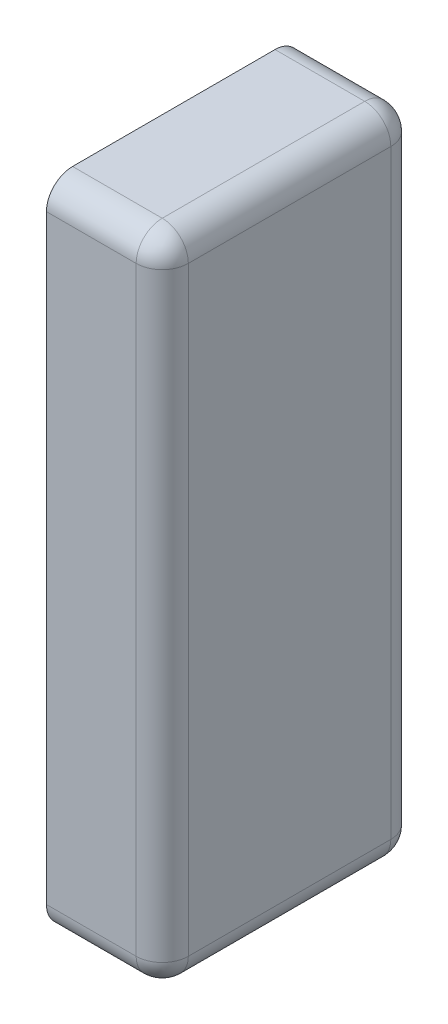
ISO-10303-21;
HEADER;
FILE_DESCRIPTION(('STEP AP214'),'2;1');
FILE_NAME('part.step','',(''),(''),'','','');
FILE_SCHEMA(('AUTOMOTIVE_DESIGN { 1 0 10303 214 1 1 1 1 }'));
ENDSEC;
DATA;
#1=APPLICATION_CONTEXT('core data for automotive mechanical design processes');
#2=APPLICATION_PROTOCOL_DEFINITION('international standard','automotive_design',2000,#1);
#3=PRODUCT_CONTEXT('',#1,'mechanical');
#4=PRODUCT('Part','Part','',(#3));
#5=PRODUCT_RELATED_PRODUCT_CATEGORY('part','',(#4));
#6=PRODUCT_DEFINITION_FORMATION('','',#4);
#7=PRODUCT_DEFINITION_CONTEXT('part definition',#1,'design');
#8=PRODUCT_DEFINITION('design','',#6,#7);
#9=PRODUCT_DEFINITION_SHAPE('','',#8);
#10=(LENGTH_UNIT() NAMED_UNIT(*) SI_UNIT(.MILLI.,.METRE.));
#11=(NAMED_UNIT(*) PLANE_ANGLE_UNIT() SI_UNIT($,.RADIAN.));
#12=(NAMED_UNIT(*) SI_UNIT($,.STERADIAN.) SOLID_ANGLE_UNIT());
#13=UNCERTAINTY_MEASURE_WITH_UNIT(LENGTH_MEASURE(1.E-05),#10,'distance_accuracy_value','');
#14=(GEOMETRIC_REPRESENTATION_CONTEXT(3) GLOBAL_UNCERTAINTY_ASSIGNED_CONTEXT((#13)) GLOBAL_UNIT_ASSIGNED_CONTEXT((#10,
#11,#12)) REPRESENTATION_CONTEXT('',''));
#15=CARTESIAN_POINT('',(0.,0.,0.));
#16=DIRECTION('',(0.,0.,1.));
#17=DIRECTION('',(1.,0.,0.));
#18=AXIS2_PLACEMENT_3D('',#15,#16,#17);
#19=CARTESIAN_POINT('',(1.912412742063,-3.238538594622,5.4145036489));
#20=DIRECTION('',(1.,0.,0.));
#21=DIRECTION('',(0.,1.,0.));
#22=AXIS2_PLACEMENT_3D('',#19,#20,#21);
#23=PLANE('',#22);
#24=CARTESIAN_POINT('',(1.912412742063,2.3,5.2145036489));
#25=DIRECTION('',(1.,0.,0.));
#26=DIRECTION('',(0.,0.707106781186548,0.707106781186548));
#27=AXIS2_PLACEMENT_3D('',#24,#25,#26);
#28=CIRCLE('',#27,0.2);
#29=CARTESIAN_POINT('',(1.912412742063,2.5,5.2145036489));
#30=VERTEX_POINT('',#29);
#31=CARTESIAN_POINT('',(1.912412742063,2.3,5.4145036489));
#32=VERTEX_POINT('',#31);
#33=EDGE_CURVE('E11',#30,#32,#28,.T.);
#34=ORIENTED_EDGE('',*,*,#33,.F.);
#35=DIRECTION('',(0.,0.,1.));
#36=VECTOR('',#35,1.);
#37=CARTESIAN_POINT('',(1.912412742063,2.5,2.70725182445));
#38=LINE('',#37,#36);
#39=CARTESIAN_POINT('',(1.912412742063,2.5,3.66225182445));
#40=VERTEX_POINT('',#39);
#41=EDGE_CURVE('E24',#40,#30,#38,.T.);
#42=ORIENTED_EDGE('',*,*,#41,.F.);
#43=CARTESIAN_POINT('',(1.912412742063,2.3,3.66225182445));
#44=DIRECTION('',(1.,0.,0.));
#45=DIRECTION('',(0.,0.707106781186548,-0.707106781186548));
#46=AXIS2_PLACEMENT_3D('',#43,#44,#45);
#47=CIRCLE('',#46,0.2);
#48=CARTESIAN_POINT('',(1.912412742063,2.3,3.46225182445));
#49=VERTEX_POINT('',#48);
#50=EDGE_CURVE('E197',#49,#40,#47,.T.);
#51=ORIENTED_EDGE('',*,*,#50,.F.);
#52=DIRECTION('',(0.,1.,0.));
#53=VECTOR('',#52,1.);
#54=CARTESIAN_POINT('',(1.912412742063,-0.369269297310772,3.46225182445));
#55=LINE('',#54,#53);
#56=CARTESIAN_POINT('',(1.912412742063,-2.3,3.46225182445));
#57=VERTEX_POINT('',#56);
#58=EDGE_CURVE('E194',#57,#49,#55,.T.);
#59=ORIENTED_EDGE('',*,*,#58,.F.);
#60=CARTESIAN_POINT('',(1.912412742063,-2.3,3.66225182445));
#61=DIRECTION('',(1.,0.,0.));
#62=DIRECTION('',(0.,-0.707106781186548,-0.707106781186548));
#63=AXIS2_PLACEMENT_3D('',#60,#61,#62);
#64=CIRCLE('',#63,0.2);
#65=CARTESIAN_POINT('',(1.912412742063,-2.5,3.66225182445));
#66=VERTEX_POINT('',#65);
#67=EDGE_CURVE('E191',#66,#57,#64,.T.);
#68=ORIENTED_EDGE('',*,*,#67,.F.);
#69=DIRECTION('',(0.,0.,-1.));
#70=VECTOR('',#69,1.);
#71=CARTESIAN_POINT('',(1.912412742063,-2.5,2.70725182445));
#72=LINE('',#71,#70);
#73=CARTESIAN_POINT('',(1.912412742063,-2.5,5.2145036489));
#74=VERTEX_POINT('',#73);
#75=EDGE_CURVE('E188',#74,#66,#72,.T.);
#76=ORIENTED_EDGE('',*,*,#75,.F.);
#77=CARTESIAN_POINT('',(1.912412742063,-2.3,5.2145036489));
#78=DIRECTION('',(1.,0.,0.));
#79=DIRECTION('',(0.,-0.707106781186548,0.707106781186548));
#80=AXIS2_PLACEMENT_3D('',#77,#78,#79);
#81=CIRCLE('',#80,0.2);
#82=CARTESIAN_POINT('',(1.912412742063,-2.3,5.4145036489));
#83=VERTEX_POINT('',#82);
#84=EDGE_CURVE('E185',#83,#74,#81,.T.);
#85=ORIENTED_EDGE('',*,*,#84,.F.);
#86=DIRECTION('',(0.,-1.,0.));
#87=VECTOR('',#86,1.);
#88=CARTESIAN_POINT('',(1.912412742063,-0.369269297310772,5.4145036489));
#89=LINE('',#88,#87);
#90=EDGE_CURVE('E182',#32,#83,#89,.T.);
#91=ORIENTED_EDGE('',*,*,#90,.F.);
#92=EDGE_LOOP('',(#34,#42,#51,#59,#68,#76,#85,#91));
#93=FACE_BOUND('',#92,.T.);
#94=ADVANCED_FACE('F17',(#93),#23,.F.);
#95=CARTESIAN_POINT('',(-3.,-2.5,0.));
#96=DIRECTION('',(0.,-1.,0.));
#97=DIRECTION('',(1.,0.,0.));
#98=AXIS2_PLACEMENT_3D('',#95,#96,#97);
#99=PLANE('',#98);
#100=ORIENTED_EDGE('',*,*,#75,.T.);
#101=DIRECTION('',(-1.,0.,0.));
#102=VECTOR('',#101,1.);
#103=CARTESIAN_POINT('',(3.319044189875,-2.5,3.66225182445));
#104=LINE('',#103,#102);
#105=CARTESIAN_POINT('',(2.6,-2.5,3.66225182445));
#106=VERTEX_POINT('',#105);
#107=EDGE_CURVE('E179',#106,#66,#104,.T.);
#108=ORIENTED_EDGE('',*,*,#107,.F.);
#109=DIRECTION('',(0.,0.,-1.));
#110=VECTOR('',#109,1.);
#111=CARTESIAN_POINT('',(2.6,-2.5,2.70725182445));
#112=LINE('',#111,#110);
#113=CARTESIAN_POINT('',(2.6,-2.5,5.2145036489));
#114=VERTEX_POINT('',#113);
#115=EDGE_CURVE('E176',#114,#106,#112,.T.);
#116=ORIENTED_EDGE('',*,*,#115,.F.);
#117=DIRECTION('',(1.,0.,0.));
#118=VECTOR('',#117,1.);
#119=CARTESIAN_POINT('',(-2.8995,-2.5,5.2145036489));
#120=LINE('',#119,#118);
#121=EDGE_CURVE('E173',#74,#114,#120,.T.);
#122=ORIENTED_EDGE('',*,*,#121,.F.);
#123=EDGE_LOOP('',(#100,#108,#116,#122));
#124=FACE_BOUND('',#123,.T.);
#125=ADVANCED_FACE('F233',(#124),#99,.T.);
#126=CARTESIAN_POINT('',(3.319044189875,-2.3,3.66225182445));
#127=DIRECTION('',(1.,0.,0.));
#128=DIRECTION('',(0.,-0.707106781186548,-0.707106781186548));
#129=AXIS2_PLACEMENT_3D('',#126,#127,#128);
#130=CYLINDRICAL_SURFACE('',#129,0.2);
#131=ORIENTED_EDGE('',*,*,#67,.T.);
#132=DIRECTION('',(1.,0.,0.));
#133=VECTOR('',#132,1.);
#134=CARTESIAN_POINT('',(3.319044189875,-2.3,3.46225182445));
#135=LINE('',#134,#133);
#136=CARTESIAN_POINT('',(2.6,-2.3,3.46225182445));
#137=VERTEX_POINT('',#136);
#138=EDGE_CURVE('E171',#57,#137,#135,.T.);
#139=ORIENTED_EDGE('',*,*,#138,.T.);
#140=CARTESIAN_POINT('',(2.6,-2.3,3.66225182445));
#141=DIRECTION('',(-1.,0.,0.));
#142=DIRECTION('',(0.,0.,-1.));
#143=AXIS2_PLACEMENT_3D('',#140,#141,#142);
#144=CIRCLE('',#143,0.2);
#145=EDGE_CURVE('E168',#137,#106,#144,.T.);
#146=ORIENTED_EDGE('',*,*,#145,.T.);
#147=ORIENTED_EDGE('',*,*,#107,.T.);
#148=EDGE_LOOP('',(#131,#139,#146,#147));
#149=FACE_BOUND('',#148,.T.);
#150=ADVANCED_FACE('F230',(#149),#130,.T.);
#151=CARTESIAN_POINT('',(9.63808837975,2.5,3.46225182445));
#152=DIRECTION('',(0.,0.,1.));
#153=DIRECTION('',(-1.,0.,0.));
#154=AXIS2_PLACEMENT_3D('',#151,#152,#153);
#155=PLANE('',#154);
#156=ORIENTED_EDGE('',*,*,#58,.T.);
#157=DIRECTION('',(-1.,0.,0.));
#158=VECTOR('',#157,1.);
#159=CARTESIAN_POINT('',(6.319044189875,2.3,3.46225182445));
#160=LINE('',#159,#158);
#161=CARTESIAN_POINT('',(2.6,2.3,3.46225182445));
#162=VERTEX_POINT('',#161);
#163=EDGE_CURVE('E165',#162,#49,#160,.T.);
#164=ORIENTED_EDGE('',*,*,#163,.F.);
#165=DIRECTION('',(0.,1.,0.));
#166=VECTOR('',#165,1.);
#167=CARTESIAN_POINT('',(2.6,2.5,3.46225182445));
#168=LINE('',#167,#166);
#169=EDGE_CURVE('E162',#137,#162,#168,.T.);
#170=ORIENTED_EDGE('',*,*,#169,.F.);
#171=ORIENTED_EDGE('',*,*,#138,.F.);
#172=EDGE_LOOP('',(#156,#164,#170,#171));
#173=FACE_BOUND('',#172,.T.);
#174=ADVANCED_FACE('F228',(#173),#155,.F.);
#175=CARTESIAN_POINT('',(-2.8995,-2.3,5.2145036489));
#176=DIRECTION('',(1.,0.,0.));
#177=DIRECTION('',(0.,-0.707106781186548,0.707106781186548));
#178=AXIS2_PLACEMENT_3D('',#175,#176,#177);
#179=CYLINDRICAL_SURFACE('',#178,0.2);
#180=ORIENTED_EDGE('',*,*,#84,.T.);
#181=ORIENTED_EDGE('',*,*,#121,.T.);
#182=CARTESIAN_POINT('',(2.6,-2.3,5.2145036489));
#183=DIRECTION('',(-1.,0.,0.));
#184=DIRECTION('',(0.,-1.,0.));
#185=AXIS2_PLACEMENT_3D('',#182,#183,#184);
#186=CIRCLE('',#185,0.2);
#187=CARTESIAN_POINT('',(2.6,-2.3,5.4145036489));
#188=VERTEX_POINT('',#187);
#189=EDGE_CURVE('E160',#114,#188,#186,.T.);
#190=ORIENTED_EDGE('',*,*,#189,.T.);
#191=DIRECTION('',(-1.,0.,0.));
#192=VECTOR('',#191,1.);
#193=CARTESIAN_POINT('',(-2.8995,-2.3,5.4145036489));
#194=LINE('',#193,#192);
#195=EDGE_CURVE('E157',#188,#83,#194,.T.);
#196=ORIENTED_EDGE('',*,*,#195,.T.);
#197=EDGE_LOOP('',(#180,#181,#190,#196));
#198=FACE_BOUND('',#197,.T.);
#199=ADVANCED_FACE('F235',(#198),#179,.T.);
#200=CARTESIAN_POINT('',(6.319044189875,2.3,3.66225182445));
#201=DIRECTION('',(-1.,0.,0.));
#202=DIRECTION('',(0.,0.707106781186548,-0.707106781186548));
#203=AXIS2_PLACEMENT_3D('',#200,#201,#202);
#204=CYLINDRICAL_SURFACE('',#203,0.2);
#205=ORIENTED_EDGE('',*,*,#50,.T.);
#206=DIRECTION('',(1.,0.,0.));
#207=VECTOR('',#206,1.);
#208=CARTESIAN_POINT('',(6.319044189875,2.5,3.66225182445));
#209=LINE('',#208,#207);
#210=CARTESIAN_POINT('',(2.6,2.5,3.66225182445));
#211=VERTEX_POINT('',#210);
#212=EDGE_CURVE('E155',#40,#211,#209,.T.);
#213=ORIENTED_EDGE('',*,*,#212,.T.);
#214=CARTESIAN_POINT('',(2.6,2.3,3.66225182445));
#215=DIRECTION('',(-1.,0.,0.));
#216=DIRECTION('',(0.,1.,0.));
#217=AXIS2_PLACEMENT_3D('',#214,#215,#216);
#218=CIRCLE('',#217,0.2);
#219=EDGE_CURVE('E152',#211,#162,#218,.T.);
#220=ORIENTED_EDGE('',*,*,#219,.T.);
#221=ORIENTED_EDGE('',*,*,#163,.T.);
#222=EDGE_LOOP('',(#205,#213,#220,#221));
#223=FACE_BOUND('',#222,.T.);
#224=ADVANCED_FACE('F225',(#223),#204,.T.);
#225=CARTESIAN_POINT('',(-2.799,2.5,5.4145036489));
#226=DIRECTION('',(0.,0.,-1.));
#227=DIRECTION('',(1.,0.,0.));
#228=AXIS2_PLACEMENT_3D('',#225,#226,#227);
#229=PLANE('',#228);
#230=ORIENTED_EDGE('',*,*,#90,.T.);
#231=ORIENTED_EDGE('',*,*,#195,.F.);
#232=DIRECTION('',(0.,-1.,0.));
#233=VECTOR('',#232,1.);
#234=CARTESIAN_POINT('',(2.6,2.5,5.4145036489));
#235=LINE('',#234,#233);
#236=CARTESIAN_POINT('',(2.6,2.3,5.4145036489));
#237=VERTEX_POINT('',#236);
#238=EDGE_CURVE('E150',#237,#188,#235,.T.);
#239=ORIENTED_EDGE('',*,*,#238,.F.);
#240=DIRECTION('',(1.,0.,0.));
#241=VECTOR('',#240,1.);
#242=CARTESIAN_POINT('',(0.1005,2.3,5.4145036489));
#243=LINE('',#242,#241);
#244=EDGE_CURVE('E148',#32,#237,#243,.T.);
#245=ORIENTED_EDGE('',*,*,#244,.F.);
#246=EDGE_LOOP('',(#230,#231,#239,#245));
#247=FACE_BOUND('',#246,.T.);
#248=ADVANCED_FACE('F205',(#247),#229,.F.);
#249=CARTESIAN_POINT('',(3.,2.5,0.));
#250=DIRECTION('',(0.,1.,0.));
#251=DIRECTION('',(-1.,0.,0.));
#252=AXIS2_PLACEMENT_3D('',#249,#250,#251);
#253=PLANE('',#252);
#254=ORIENTED_EDGE('',*,*,#41,.T.);
#255=DIRECTION('',(-1.,0.,0.));
#256=VECTOR('',#255,1.);
#257=CARTESIAN_POINT('',(0.1005,2.5,5.2145036489));
#258=LINE('',#257,#256);
#259=CARTESIAN_POINT('',(2.6,2.5,5.2145036489));
#260=VERTEX_POINT('',#259);
#261=EDGE_CURVE('E146',#260,#30,#258,.T.);
#262=ORIENTED_EDGE('',*,*,#261,.F.);
#263=DIRECTION('',(0.,0.,1.));
#264=VECTOR('',#263,1.);
#265=CARTESIAN_POINT('',(2.6,2.5,2.70725182445));
#266=LINE('',#265,#264);
#267=EDGE_CURVE('E125',#211,#260,#266,.T.);
#268=ORIENTED_EDGE('',*,*,#267,.F.);
#269=ORIENTED_EDGE('',*,*,#212,.F.);
#270=EDGE_LOOP('',(#254,#262,#268,#269));
#271=FACE_BOUND('',#270,.T.);
#272=ADVANCED_FACE('F201',(#271),#253,.T.);
#273=CARTESIAN_POINT('',(0.1005,2.3,5.2145036489));
#274=DIRECTION('',(-1.,0.,0.));
#275=DIRECTION('',(0.,0.707106781186548,0.707106781186548));
#276=AXIS2_PLACEMENT_3D('',#273,#274,#275);
#277=CYLINDRICAL_SURFACE('',#276,0.2);
#278=ORIENTED_EDGE('',*,*,#33,.T.);
#279=ORIENTED_EDGE('',*,*,#244,.T.);
#280=CARTESIAN_POINT('',(2.6,2.3,5.2145036489));
#281=DIRECTION('',(-1.,0.,0.));
#282=DIRECTION('',(0.,0.,1.));
#283=AXIS2_PLACEMENT_3D('',#280,#281,#282);
#284=CIRCLE('',#283,0.2);
#285=EDGE_CURVE('E120',#237,#260,#284,.T.);
#286=ORIENTED_EDGE('',*,*,#285,.T.);
#287=ORIENTED_EDGE('',*,*,#261,.T.);
#288=EDGE_LOOP('',(#278,#279,#286,#287));
#289=FACE_BOUND('',#288,.T.);
#290=ADVANCED_FACE('F202',(#289),#277,.T.);
#291=CARTESIAN_POINT('',(2.6,2.5,3.66225182445));
#292=DIRECTION('',(0.,1.,0.));
#293=DIRECTION('',(0.707106781186548,0.,-0.707106781186548));
#294=AXIS2_PLACEMENT_3D('',#291,#292,#293);
#295=CYLINDRICAL_SURFACE('',#294,0.2);
#296=CARTESIAN_POINT('',(2.6,-2.3,3.66225182445));
#297=DIRECTION('',(0.,1.,0.));
#298=DIRECTION('',(1.,0.,0.));
#299=AXIS2_PLACEMENT_3D('',#296,#297,#298);
#300=CIRCLE('',#299,0.2);
#301=CARTESIAN_POINT('',(2.8,-2.3,3.66225182445));
#302=VERTEX_POINT('',#301);
#303=EDGE_CURVE('E141',#302,#137,#300,.T.);
#304=ORIENTED_EDGE('',*,*,#303,.T.);
#305=ORIENTED_EDGE('',*,*,#169,.T.);
#306=CARTESIAN_POINT('',(2.6,2.3,3.66225182445));
#307=DIRECTION('',(0.,-1.,0.));
#308=DIRECTION('',(0.,0.,-1.));
#309=AXIS2_PLACEMENT_3D('',#306,#307,#308);
#310=CIRCLE('',#309,0.2);
#311=CARTESIAN_POINT('',(2.8,2.3,3.66225182445));
#312=VERTEX_POINT('',#311);
#313=EDGE_CURVE('E139',#162,#312,#310,.T.);
#314=ORIENTED_EDGE('',*,*,#313,.T.);
#315=DIRECTION('',(0.,-1.,0.));
#316=VECTOR('',#315,1.);
#317=CARTESIAN_POINT('',(2.8,2.5,3.66225182445));
#318=LINE('',#317,#316);
#319=EDGE_CURVE('E98',#312,#302,#318,.T.);
#320=ORIENTED_EDGE('',*,*,#319,.T.);
#321=EDGE_LOOP('',(#304,#305,#314,#320));
#322=FACE_BOUND('',#321,.T.);
#323=ADVANCED_FACE('F219',(#322),#295,.T.);
#324=CARTESIAN_POINT('',(2.6,-2.3,3.66225182445));
#325=DIRECTION('',(-0.408248290463864,-0.816496580927725,0.408248290463864));
#326=DIRECTION('',(0.577350269189625,-0.577350269189627,-0.577350269189625));
#327=AXIS2_PLACEMENT_3D('',#324,#325,#326);
#328=SPHERICAL_SURFACE('',#327,0.2);
#329=ORIENTED_EDGE('',*,*,#303,.F.);
#330=CARTESIAN_POINT('',(2.6,-2.3,3.66225182445));
#331=DIRECTION('',(0.,0.,-1.));
#332=DIRECTION('',(0.707106781186548,-0.707106781186548,0.));
#333=AXIS2_PLACEMENT_3D('',#330,#331,#332);
#334=CIRCLE('',#333,0.2);
#335=EDGE_CURVE('E135',#302,#106,#334,.T.);
#336=ORIENTED_EDGE('',*,*,#335,.T.);
#337=ORIENTED_EDGE('',*,*,#145,.F.);
#338=EDGE_LOOP('',(#329,#336,#337));
#339=FACE_BOUND('',#338,.T.);
#340=ADVANCED_FACE('F216',(#339),#328,.T.);
#341=CARTESIAN_POINT('',(2.6,2.3,3.66225182445));
#342=DIRECTION('',(0.408248290463864,-0.816496580927725,-0.408248290463864));
#343=DIRECTION('',(0.577350269189625,0.577350269189627,-0.577350269189625));
#344=AXIS2_PLACEMENT_3D('',#341,#342,#343);
#345=SPHERICAL_SURFACE('',#344,0.2);
#346=ORIENTED_EDGE('',*,*,#219,.F.);
#347=CARTESIAN_POINT('',(2.6,2.3,3.66225182445));
#348=DIRECTION('',(0.,0.,-1.));
#349=DIRECTION('',(0.707106781186548,0.707106781186548,0.));
#350=AXIS2_PLACEMENT_3D('',#347,#348,#349);
#351=CIRCLE('',#350,0.2);
#352=EDGE_CURVE('E133',#211,#312,#351,.T.);
#353=ORIENTED_EDGE('',*,*,#352,.T.);
#354=ORIENTED_EDGE('',*,*,#313,.F.);
#355=EDGE_LOOP('',(#346,#353,#354));
#356=FACE_BOUND('',#355,.T.);
#357=ADVANCED_FACE('F223',(#356),#345,.T.);
#358=CARTESIAN_POINT('',(2.6,-2.3,2.70725182445));
#359=DIRECTION('',(0.,0.,-1.));
#360=DIRECTION('',(0.707106781186548,-0.707106781186548,0.));
#361=AXIS2_PLACEMENT_3D('',#358,#359,#360);
#362=CYLINDRICAL_SURFACE('',#361,0.2);
#363=ORIENTED_EDGE('',*,*,#335,.F.);
#364=DIRECTION('',(0.,0.,1.));
#365=VECTOR('',#364,1.);
#366=CARTESIAN_POINT('',(2.8,-2.3,2.70725182445));
#367=LINE('',#366,#365);
#368=CARTESIAN_POINT('',(2.8,-2.3,5.2145036489));
#369=VERTEX_POINT('',#368);
#370=EDGE_CURVE('E131',#302,#369,#367,.T.);
#371=ORIENTED_EDGE('',*,*,#370,.T.);
#372=CARTESIAN_POINT('',(2.6,-2.3,5.2145036489));
#373=DIRECTION('',(0.,0.,1.));
#374=DIRECTION('',(0.707106781186548,-0.707106781186548,0.));
#375=AXIS2_PLACEMENT_3D('',#372,#373,#374);
#376=CIRCLE('',#375,0.2);
#377=EDGE_CURVE('E103',#114,#369,#376,.T.);
#378=ORIENTED_EDGE('',*,*,#377,.F.);
#379=ORIENTED_EDGE('',*,*,#115,.T.);
#380=EDGE_LOOP('',(#363,#371,#378,#379));
#381=FACE_BOUND('',#380,.T.);
#382=ADVANCED_FACE('F213',(#381),#362,.T.);
#383=CARTESIAN_POINT('',(2.8,2.5,5.4145036489));
#384=DIRECTION('',(1.,0.,0.));
#385=DIRECTION('',(0.,0.,-1.));
#386=AXIS2_PLACEMENT_3D('',#383,#384,#385);
#387=PLANE('',#386);
#388=ORIENTED_EDGE('',*,*,#319,.F.);
#389=DIRECTION('',(0.,0.,-1.));
#390=VECTOR('',#389,1.);
#391=CARTESIAN_POINT('',(2.8,2.3,2.70725182445));
#392=LINE('',#391,#390);
#393=CARTESIAN_POINT('',(2.8,2.3,5.2145036489));
#394=VERTEX_POINT('',#393);
#395=EDGE_CURVE('E91',#394,#312,#392,.T.);
#396=ORIENTED_EDGE('',*,*,#395,.F.);
#397=DIRECTION('',(0.,1.,0.));
#398=VECTOR('',#397,1.);
#399=CARTESIAN_POINT('',(2.8,2.5,5.2145036489));
#400=LINE('',#399,#398);
#401=EDGE_CURVE('E95',#369,#394,#400,.T.);
#402=ORIENTED_EDGE('',*,*,#401,.F.);
#403=ORIENTED_EDGE('',*,*,#370,.F.);
#404=EDGE_LOOP('',(#388,#396,#402,#403));
#405=FACE_BOUND('',#404,.T.);
#406=ADVANCED_FACE('F93',(#405),#387,.T.);
#407=CARTESIAN_POINT('',(2.6,2.5,5.2145036489));
#408=DIRECTION('',(0.,-1.,0.));
#409=DIRECTION('',(0.707106781186548,0.,0.707106781186548));
#410=AXIS2_PLACEMENT_3D('',#407,#408,#409);
#411=CYLINDRICAL_SURFACE('',#410,0.2);
#412=CARTESIAN_POINT('',(2.6,2.3,5.2145036489));
#413=DIRECTION('',(0.,-1.,0.));
#414=DIRECTION('',(1.,0.,0.));
#415=AXIS2_PLACEMENT_3D('',#412,#413,#414);
#416=CIRCLE('',#415,0.2);
#417=EDGE_CURVE('E110',#394,#237,#416,.T.);
#418=ORIENTED_EDGE('',*,*,#417,.T.);
#419=ORIENTED_EDGE('',*,*,#238,.T.);
#420=CARTESIAN_POINT('',(2.6,-2.3,5.2145036489));
#421=DIRECTION('',(0.,1.,0.));
#422=DIRECTION('',(0.,0.,1.));
#423=AXIS2_PLACEMENT_3D('',#420,#421,#422);
#424=CIRCLE('',#423,0.2);
#425=EDGE_CURVE('E112',#188,#369,#424,.T.);
#426=ORIENTED_EDGE('',*,*,#425,.T.);
#427=ORIENTED_EDGE('',*,*,#401,.T.);
#428=EDGE_LOOP('',(#418,#419,#426,#427));
#429=FACE_BOUND('',#428,.T.);
#430=ADVANCED_FACE('F108',(#429),#411,.T.);
#431=CARTESIAN_POINT('',(2.6,-2.3,5.2145036489));
#432=DIRECTION('',(-0.408248290463864,-0.816496580927725,-0.408248290463864));
#433=DIRECTION('',(0.577350269189624,-0.577350269189627,0.577350269189626));
#434=AXIS2_PLACEMENT_3D('',#431,#432,#433);
#435=SPHERICAL_SURFACE('',#434,0.2);
#436=ORIENTED_EDGE('',*,*,#189,.F.);
#437=ORIENTED_EDGE('',*,*,#377,.T.);
#438=ORIENTED_EDGE('',*,*,#425,.F.);
#439=EDGE_LOOP('',(#436,#437,#438));
#440=FACE_BOUND('',#439,.T.);
#441=ADVANCED_FACE('F209',(#440),#435,.T.);
#442=CARTESIAN_POINT('',(2.6,2.3,5.2145036489));
#443=DIRECTION('',(0.408248290463864,-0.816496580927725,0.408248290463864));
#444=DIRECTION('',(0.577350269189624,0.577350269189627,0.577350269189626));
#445=AXIS2_PLACEMENT_3D('',#442,#443,#444);
#446=SPHERICAL_SURFACE('',#445,0.2);
#447=ORIENTED_EDGE('',*,*,#417,.F.);
#448=CARTESIAN_POINT('',(2.6,2.3,5.2145036489));
#449=DIRECTION('',(0.,0.,1.));
#450=DIRECTION('',(0.707106781186548,0.707106781186548,0.));
#451=AXIS2_PLACEMENT_3D('',#448,#449,#450);
#452=CIRCLE('',#451,0.2);
#453=EDGE_CURVE('E118',#394,#260,#452,.T.);
#454=ORIENTED_EDGE('',*,*,#453,.T.);
#455=ORIENTED_EDGE('',*,*,#285,.F.);
#456=EDGE_LOOP('',(#447,#454,#455));
#457=FACE_BOUND('',#456,.T.);
#458=ADVANCED_FACE('F117',(#457),#446,.T.);
#459=CARTESIAN_POINT('',(2.6,2.3,2.70725182445));
#460=DIRECTION('',(0.,0.,1.));
#461=DIRECTION('',(0.707106781186548,0.707106781186548,0.));
#462=AXIS2_PLACEMENT_3D('',#459,#460,#461);
#463=CYLINDRICAL_SURFACE('',#462,0.2);
#464=ORIENTED_EDGE('',*,*,#352,.F.);
#465=ORIENTED_EDGE('',*,*,#267,.T.);
#466=ORIENTED_EDGE('',*,*,#453,.F.);
#467=ORIENTED_EDGE('',*,*,#395,.T.);
#468=EDGE_LOOP('',(#464,#465,#466,#467));
#469=FACE_BOUND('',#468,.T.);
#470=ADVANCED_FACE('F123',(#469),#463,.T.);
#471=CLOSED_SHELL('',(#94,#125,#150,#174,#199,#224,#248,#272,#290,#323,#340,#357,#382,#406,#430,
#441,#458,#470));
#472=MANIFOLD_SOLID_BREP('B1',#471);
#473=ADVANCED_BREP_SHAPE_REPRESENTATION('',(#18,#472),#14);
#474=SHAPE_DEFINITION_REPRESENTATION(#9,#473);
ENDSEC;
END-ISO-10303-21;
